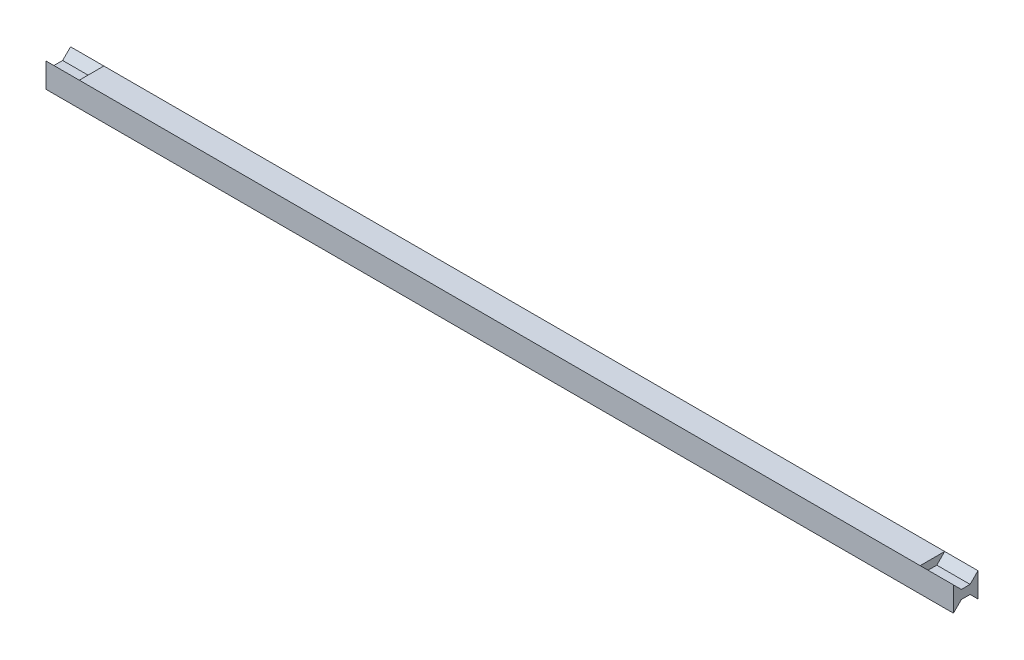
ISO-10303-21;
HEADER;
FILE_DESCRIPTION(('STEP AP214'),'2;1');
FILE_NAME('part.step','',(''),(''),'','','');
FILE_SCHEMA(('AUTOMOTIVE_DESIGN { 1 0 10303 214 1 1 1 1 }'));
ENDSEC;
DATA;
#1=APPLICATION_CONTEXT('core data for automotive mechanical design processes');
#2=APPLICATION_PROTOCOL_DEFINITION('international standard','automotive_design',2000,#1);
#3=PRODUCT_CONTEXT('',#1,'mechanical');
#4=PRODUCT('Part','Part','',(#3));
#5=PRODUCT_RELATED_PRODUCT_CATEGORY('part','',(#4));
#6=PRODUCT_DEFINITION_FORMATION('','',#4);
#7=PRODUCT_DEFINITION_CONTEXT('part definition',#1,'design');
#8=PRODUCT_DEFINITION('design','',#6,#7);
#9=PRODUCT_DEFINITION_SHAPE('','',#8);
#10=(LENGTH_UNIT() NAMED_UNIT(*) SI_UNIT(.MILLI.,.METRE.));
#11=(NAMED_UNIT(*) PLANE_ANGLE_UNIT() SI_UNIT($,.RADIAN.));
#12=(NAMED_UNIT(*) SI_UNIT($,.STERADIAN.) SOLID_ANGLE_UNIT());
#13=UNCERTAINTY_MEASURE_WITH_UNIT(LENGTH_MEASURE(1.E-05),#10,'distance_accuracy_value','');
#14=(GEOMETRIC_REPRESENTATION_CONTEXT(3) GLOBAL_UNCERTAINTY_ASSIGNED_CONTEXT((#13)) GLOBAL_UNIT_ASSIGNED_CONTEXT((#10,
#11,#12)) REPRESENTATION_CONTEXT('',''));
#15=CARTESIAN_POINT('',(0.,0.,0.));
#16=DIRECTION('',(0.,0.,1.));
#17=DIRECTION('',(1.,0.,0.));
#18=AXIS2_PLACEMENT_3D('',#15,#16,#17);
#19=CARTESIAN_POINT('',(202.,5.9,0.));
#20=DIRECTION('',(-1.,0.,0.));
#21=DIRECTION('',(0.,0.,1.));
#22=AXIS2_PLACEMENT_3D('',#19,#20,#21);
#23=PLANE('',#22);
#24=DIRECTION('',(0.,0.707106781186551,0.707106781186544));
#25=VECTOR('',#24,1.);
#26=CARTESIAN_POINT('',(202.,4.,-1.89999999999998));
#27=LINE('',#26,#25);
#28=CARTESIAN_POINT('',(202.,4.,-1.89999999999998));
#29=VERTEX_POINT('',#28);
#30=CARTESIAN_POINT('',(202.,5.9,0.));
#31=VERTEX_POINT('',#30);
#32=EDGE_CURVE('E50',#29,#31,#27,.T.);
#33=ORIENTED_EDGE('',*,*,#32,.F.);
#34=DIRECTION('',(0.,0.,1.));
#35=VECTOR('',#34,1.);
#36=CARTESIAN_POINT('',(202.,4.,-4.00000000000005));
#37=LINE('',#36,#35);
#38=CARTESIAN_POINT('',(202.,4.,-4.00000000000005));
#39=VERTEX_POINT('',#38);
#40=EDGE_CURVE('E54',#39,#29,#37,.T.);
#41=ORIENTED_EDGE('',*,*,#40,.F.);
#42=DIRECTION('',(0.,-0.707106781186551,0.707106781186544));
#43=VECTOR('',#42,1.);
#44=CARTESIAN_POINT('',(202.,5.9,-5.90000000000003));
#45=LINE('',#44,#43);
#46=CARTESIAN_POINT('',(202.,5.9,-5.90000000000003));
#47=VERTEX_POINT('',#46);
#48=EDGE_CURVE('E290',#47,#39,#45,.T.);
#49=ORIENTED_EDGE('',*,*,#48,.F.);
#50=DIRECTION('',(0.,0.,-1.));
#51=VECTOR('',#50,1.);
#52=CARTESIAN_POINT('',(202.,5.9,0.));
#53=LINE('',#52,#51);
#54=EDGE_CURVE('E42',#31,#47,#53,.T.);
#55=ORIENTED_EDGE('',*,*,#54,.F.);
#56=EDGE_LOOP('',(#33,#41,#49,#55));
#57=FACE_BOUND('',#56,.T.);
#58=ADVANCED_FACE('F33',(#57),#23,.F.);
#59=DIRECTION('',(0.,-0.707106781186551,-0.707106781186544));
#60=VECTOR('',#59,1.);
#61=CARTESIAN_POINT('',(202.,1.9,-4.00000000000005));
#62=LINE('',#61,#60);
#63=CARTESIAN_POINT('',(202.,1.9,-4.00000000000005));
#64=VERTEX_POINT('',#63);
#65=CARTESIAN_POINT('',(202.,0.,-5.90000000000003));
#66=VERTEX_POINT('',#65);
#67=EDGE_CURVE('E294',#64,#66,#62,.T.);
#68=ORIENTED_EDGE('',*,*,#67,.F.);
#69=DIRECTION('',(0.,0.,-1.));
#70=VECTOR('',#69,1.);
#71=CARTESIAN_POINT('',(202.,1.9,-1.89999999999998));
#72=LINE('',#71,#70);
#73=CARTESIAN_POINT('',(202.,1.9,-1.89999999999998));
#74=VERTEX_POINT('',#73);
#75=EDGE_CURVE('E297',#74,#64,#72,.T.);
#76=ORIENTED_EDGE('',*,*,#75,.F.);
#77=DIRECTION('',(0.,0.707106781186551,-0.707106781186543));
#78=VECTOR('',#77,1.);
#79=CARTESIAN_POINT('',(202.,0.,0.));
#80=LINE('',#79,#78);
#81=CARTESIAN_POINT('',(202.,0.,0.));
#82=VERTEX_POINT('',#81);
#83=EDGE_CURVE('E321',#82,#74,#80,.T.);
#84=ORIENTED_EDGE('',*,*,#83,.F.);
#85=DIRECTION('',(0.,0.,-1.));
#86=VECTOR('',#85,1.);
#87=CARTESIAN_POINT('',(202.,0.,0.));
#88=LINE('',#87,#86);
#89=EDGE_CURVE('E244',#82,#66,#88,.T.);
#90=ORIENTED_EDGE('',*,*,#89,.T.);
#91=EDGE_LOOP('',(#68,#76,#84,#90));
#92=FACE_BOUND('',#91,.T.);
#93=ADVANCED_FACE('F349',(#92),#23,.F.);
#94=CARTESIAN_POINT('',(0.,5.9,-5.9));
#95=DIRECTION('',(1.,0.,0.));
#96=DIRECTION('',(0.,0.,-1.));
#97=AXIS2_PLACEMENT_3D('',#94,#95,#96);
#98=PLANE('',#97);
#99=DIRECTION('',(0.,0.707106781186551,-0.707106781186544));
#100=VECTOR('',#99,1.);
#101=CARTESIAN_POINT('',(0.,4.,-4.00000000000002));
#102=LINE('',#101,#100);
#103=CARTESIAN_POINT('',(0.,4.,-4.00000000000002));
#104=VERTEX_POINT('',#103);
#105=CARTESIAN_POINT('',(0.,5.9,-5.9));
#106=VERTEX_POINT('',#105);
#107=EDGE_CURVE('E169',#104,#106,#102,.T.);
#108=ORIENTED_EDGE('',*,*,#107,.F.);
#109=DIRECTION('',(0.,0.,-1.));
#110=VECTOR('',#109,1.);
#111=CARTESIAN_POINT('',(0.,4.,-1.89999999999998));
#112=LINE('',#111,#110);
#113=CARTESIAN_POINT('',(0.,4.,-1.89999999999998));
#114=VERTEX_POINT('',#113);
#115=EDGE_CURVE('E182',#114,#104,#112,.T.);
#116=ORIENTED_EDGE('',*,*,#115,.F.);
#117=DIRECTION('',(0.,-0.707106781186552,-0.707106781186543));
#118=VECTOR('',#117,1.);
#119=CARTESIAN_POINT('',(0.,5.9,0.));
#120=LINE('',#119,#118);
#121=CARTESIAN_POINT('',(0.,5.9,0.));
#122=VERTEX_POINT('',#121);
#123=EDGE_CURVE('E205',#122,#114,#120,.T.);
#124=ORIENTED_EDGE('',*,*,#123,.F.);
#125=DIRECTION('',(0.,0.,1.));
#126=VECTOR('',#125,1.);
#127=CARTESIAN_POINT('',(0.,5.9,-5.9));
#128=LINE('',#127,#126);
#129=EDGE_CURVE('E234',#106,#122,#128,.T.);
#130=ORIENTED_EDGE('',*,*,#129,.F.);
#131=EDGE_LOOP('',(#108,#116,#124,#130));
#132=FACE_BOUND('',#131,.T.);
#133=ADVANCED_FACE('F35',(#132),#98,.F.);
#134=DIRECTION('',(0.,-0.707106781186543,0.707106781186552));
#135=VECTOR('',#134,1.);
#136=CARTESIAN_POINT('',(0.,1.9,-1.90000000000002));
#137=LINE('',#136,#135);
#138=CARTESIAN_POINT('',(0.,1.9,-1.90000000000002));
#139=VERTEX_POINT('',#138);
#140=CARTESIAN_POINT('',(0.,0.,0.));
#141=VERTEX_POINT('',#140);
#142=EDGE_CURVE('E202',#139,#141,#137,.T.);
#143=ORIENTED_EDGE('',*,*,#142,.F.);
#144=DIRECTION('',(0.,0.,1.));
#145=VECTOR('',#144,1.);
#146=CARTESIAN_POINT('',(0.,1.9,-4.00000000000002));
#147=LINE('',#146,#145);
#148=CARTESIAN_POINT('',(0.,1.9,-4.00000000000002));
#149=VERTEX_POINT('',#148);
#150=EDGE_CURVE('E199',#149,#139,#147,.T.);
#151=ORIENTED_EDGE('',*,*,#150,.F.);
#152=DIRECTION('',(0.,0.707106781186552,0.707106781186543));
#153=VECTOR('',#152,1.);
#154=CARTESIAN_POINT('',(0.,0.,-5.9));
#155=LINE('',#154,#153);
#156=CARTESIAN_POINT('',(0.,0.,-5.9));
#157=VERTEX_POINT('',#156);
#158=EDGE_CURVE('E172',#157,#149,#155,.T.);
#159=ORIENTED_EDGE('',*,*,#158,.F.);
#160=DIRECTION('',(0.,0.,1.));
#161=VECTOR('',#160,1.);
#162=CARTESIAN_POINT('',(0.,0.,-5.9));
#163=LINE('',#162,#161);
#164=EDGE_CURVE('E233',#157,#141,#163,.T.);
#165=ORIENTED_EDGE('',*,*,#164,.T.);
#166=EDGE_LOOP('',(#143,#151,#159,#165));
#167=FACE_BOUND('',#166,.T.);
#168=ADVANCED_FACE('F357',(#167),#98,.F.);
#169=CARTESIAN_POINT('',(0.,5.9,0.));
#170=DIRECTION('',(0.,0.,-1.));
#171=DIRECTION('',(-1.,0.,0.));
#172=AXIS2_PLACEMENT_3D('',#169,#170,#171);
#173=PLANE('',#172);
#174=DIRECTION('',(1.,0.,0.));
#175=VECTOR('',#174,1.);
#176=CARTESIAN_POINT('',(0.,0.,0.));
#177=LINE('',#176,#175);
#178=EDGE_CURVE('E243',#141,#82,#177,.T.);
#179=ORIENTED_EDGE('',*,*,#178,.T.);
#180=DIRECTION('',(-1.,0.,0.));
#181=VECTOR('',#180,1.);
#182=CARTESIAN_POINT('',(210.,0.,0.));
#183=LINE('',#182,#181);
#184=CARTESIAN_POINT('',(210.,0.,0.));
#185=VERTEX_POINT('',#184);
#186=EDGE_CURVE('E154',#185,#82,#183,.T.);
#187=ORIENTED_EDGE('',*,*,#186,.F.);
#188=DIRECTION('',(0.,-1.,0.));
#189=VECTOR('',#188,1.);
#190=CARTESIAN_POINT('',(210.,5.9,0.));
#191=LINE('',#190,#189);
#192=CARTESIAN_POINT('',(210.,5.9,0.));
#193=VERTEX_POINT('',#192);
#194=EDGE_CURVE('E146',#193,#185,#191,.T.);
#195=ORIENTED_EDGE('',*,*,#194,.F.);
#196=DIRECTION('',(-1.,0.,0.));
#197=VECTOR('',#196,1.);
#198=CARTESIAN_POINT('',(210.,5.9,0.));
#199=LINE('',#198,#197);
#200=EDGE_CURVE('E152',#193,#31,#199,.T.);
#201=ORIENTED_EDGE('',*,*,#200,.T.);
#202=DIRECTION('',(1.,0.,0.));
#203=VECTOR('',#202,1.);
#204=CARTESIAN_POINT('',(0.,5.9,0.));
#205=LINE('',#204,#203);
#206=EDGE_CURVE('E237',#122,#31,#205,.T.);
#207=ORIENTED_EDGE('',*,*,#206,.F.);
#208=DIRECTION('',(1.,0.,0.));
#209=VECTOR('',#208,1.);
#210=CARTESIAN_POINT('',(-8.,5.9,0.));
#211=LINE('',#210,#209);
#212=CARTESIAN_POINT('',(-8.,5.9,0.));
#213=VERTEX_POINT('',#212);
#214=EDGE_CURVE('E215',#213,#122,#211,.T.);
#215=ORIENTED_EDGE('',*,*,#214,.F.);
#216=DIRECTION('',(0.,1.,0.));
#217=VECTOR('',#216,1.);
#218=CARTESIAN_POINT('',(-8.,0.,0.));
#219=LINE('',#218,#217);
#220=CARTESIAN_POINT('',(-8.,0.,0.));
#221=VERTEX_POINT('',#220);
#222=EDGE_CURVE('E190',#221,#213,#219,.T.);
#223=ORIENTED_EDGE('',*,*,#222,.F.);
#224=DIRECTION('',(1.,0.,0.));
#225=VECTOR('',#224,1.);
#226=CARTESIAN_POINT('',(-8.,0.,0.));
#227=LINE('',#226,#225);
#228=EDGE_CURVE('E218',#221,#141,#227,.T.);
#229=ORIENTED_EDGE('',*,*,#228,.T.);
#230=EDGE_LOOP('',(#179,#187,#195,#201,#207,#215,#223,#229));
#231=FACE_BOUND('',#230,.T.);
#232=ADVANCED_FACE('F149',(#231),#173,.F.);
#233=CARTESIAN_POINT('',(202.,5.9,-5.90000000000003));
#234=DIRECTION('',(0.,0.,1.));
#235=DIRECTION('',(1.,0.,0.));
#236=AXIS2_PLACEMENT_3D('',#233,#234,#235);
#237=PLANE('',#236);
#238=DIRECTION('',(-1.,0.,0.));
#239=VECTOR('',#238,1.);
#240=CARTESIAN_POINT('',(202.,0.,-5.90000000000003));
#241=LINE('',#240,#239);
#242=EDGE_CURVE('E37',#66,#157,#241,.T.);
#243=ORIENTED_EDGE('',*,*,#242,.T.);
#244=DIRECTION('',(1.,0.,0.));
#245=VECTOR('',#244,1.);
#246=CARTESIAN_POINT('',(-8.,0.,-5.9));
#247=LINE('',#246,#245);
#248=CARTESIAN_POINT('',(-8.,0.,-5.9));
#249=VERTEX_POINT('',#248);
#250=EDGE_CURVE('E227',#249,#157,#247,.T.);
#251=ORIENTED_EDGE('',*,*,#250,.F.);
#252=DIRECTION('',(0.,-1.,0.));
#253=VECTOR('',#252,1.);
#254=CARTESIAN_POINT('',(-8.,5.9,-5.9));
#255=LINE('',#254,#253);
#256=CARTESIAN_POINT('',(-8.,5.9,-5.9));
#257=VERTEX_POINT('',#256);
#258=EDGE_CURVE('E181',#257,#249,#255,.T.);
#259=ORIENTED_EDGE('',*,*,#258,.F.);
#260=DIRECTION('',(1.,0.,0.));
#261=VECTOR('',#260,1.);
#262=CARTESIAN_POINT('',(-8.,5.9,-5.9));
#263=LINE('',#262,#261);
#264=EDGE_CURVE('E230',#257,#106,#263,.T.);
#265=ORIENTED_EDGE('',*,*,#264,.T.);
#266=DIRECTION('',(-1.,0.,0.));
#267=VECTOR('',#266,1.);
#268=CARTESIAN_POINT('',(202.,5.9,-5.90000000000003));
#269=LINE('',#268,#267);
#270=EDGE_CURVE('E11',#47,#106,#269,.T.);
#271=ORIENTED_EDGE('',*,*,#270,.F.);
#272=DIRECTION('',(-1.,0.,0.));
#273=VECTOR('',#272,1.);
#274=CARTESIAN_POINT('',(210.,5.9,-5.90000000000003));
#275=LINE('',#274,#273);
#276=CARTESIAN_POINT('',(210.,5.9,-5.90000000000003));
#277=VERTEX_POINT('',#276);
#278=EDGE_CURVE('E305',#277,#47,#275,.T.);
#279=ORIENTED_EDGE('',*,*,#278,.F.);
#280=DIRECTION('',(0.,1.,0.));
#281=VECTOR('',#280,1.);
#282=CARTESIAN_POINT('',(210.,0.,-5.90000000000003));
#283=LINE('',#282,#281);
#284=CARTESIAN_POINT('',(210.,0.,-5.90000000000003));
#285=VERTEX_POINT('',#284);
#286=EDGE_CURVE('E328',#285,#277,#283,.T.);
#287=ORIENTED_EDGE('',*,*,#286,.F.);
#288=DIRECTION('',(-1.,0.,0.));
#289=VECTOR('',#288,1.);
#290=CARTESIAN_POINT('',(210.,0.,-5.90000000000003));
#291=LINE('',#290,#289);
#292=EDGE_CURVE('E257',#285,#66,#291,.T.);
#293=ORIENTED_EDGE('',*,*,#292,.T.);
#294=EDGE_LOOP('',(#243,#251,#259,#265,#271,#279,#287,#293));
#295=FACE_BOUND('',#294,.T.);
#296=ADVANCED_FACE('F253',(#295),#237,.F.);
#297=CARTESIAN_POINT('',(0.,5.9,0.));
#298=DIRECTION('',(0.,1.,0.));
#299=DIRECTION('',(0.,0.,1.));
#300=AXIS2_PLACEMENT_3D('',#297,#298,#299);
#301=PLANE('',#300);
#302=ORIENTED_EDGE('',*,*,#129,.T.);
#303=ORIENTED_EDGE('',*,*,#206,.T.);
#304=ORIENTED_EDGE('',*,*,#54,.T.);
#305=ORIENTED_EDGE('',*,*,#270,.T.);
#306=EDGE_LOOP('',(#302,#303,#304,#305));
#307=FACE_BOUND('',#306,.T.);
#308=ADVANCED_FACE('F289',(#307),#301,.T.);
#309=CARTESIAN_POINT('',(0.,0.,0.));
#310=DIRECTION('',(0.,1.,0.));
#311=DIRECTION('',(0.,0.,1.));
#312=AXIS2_PLACEMENT_3D('',#309,#310,#311);
#313=PLANE('',#312);
#314=ORIENTED_EDGE('',*,*,#164,.F.);
#315=ORIENTED_EDGE('',*,*,#242,.F.);
#316=ORIENTED_EDGE('',*,*,#89,.F.);
#317=ORIENTED_EDGE('',*,*,#178,.F.);
#318=EDGE_LOOP('',(#314,#315,#316,#317));
#319=FACE_BOUND('',#318,.T.);
#320=ADVANCED_FACE('F260',(#319),#313,.F.);
#321=CARTESIAN_POINT('',(-8.,4.,-4.00000000000002));
#322=DIRECTION('',(0.,-0.707106781186544,-0.707106781186551));
#323=DIRECTION('',(0.,0.707106781186551,-0.707106781186544));
#324=AXIS2_PLACEMENT_3D('',#321,#322,#323);
#325=PLANE('',#324);
#326=ORIENTED_EDGE('',*,*,#107,.T.);
#327=ORIENTED_EDGE('',*,*,#264,.F.);
#328=DIRECTION('',(0.,0.707106781186551,-0.707106781186544));
#329=VECTOR('',#328,1.);
#330=CARTESIAN_POINT('',(-8.,4.,-4.00000000000002));
#331=LINE('',#330,#329);
#332=CARTESIAN_POINT('',(-8.,4.,-4.00000000000002));
#333=VERTEX_POINT('',#332);
#334=EDGE_CURVE('E178',#333,#257,#331,.T.);
#335=ORIENTED_EDGE('',*,*,#334,.F.);
#336=DIRECTION('',(1.,0.,0.));
#337=VECTOR('',#336,1.);
#338=CARTESIAN_POINT('',(-8.,4.,-4.00000000000002));
#339=LINE('',#338,#337);
#340=EDGE_CURVE('E195',#333,#104,#339,.T.);
#341=ORIENTED_EDGE('',*,*,#340,.T.);
#342=EDGE_LOOP('',(#326,#327,#335,#341));
#343=FACE_BOUND('',#342,.T.);
#344=ADVANCED_FACE('F275',(#343),#325,.F.);
#345=CARTESIAN_POINT('',(-8.,0.,-5.9));
#346=DIRECTION('',(0.,0.707106781186543,-0.707106781186552));
#347=DIRECTION('',(0.,0.707106781186552,0.707106781186543));
#348=AXIS2_PLACEMENT_3D('',#345,#346,#347);
#349=PLANE('',#348);
#350=ORIENTED_EDGE('',*,*,#158,.T.);
#351=DIRECTION('',(1.,0.,0.));
#352=VECTOR('',#351,1.);
#353=CARTESIAN_POINT('',(-8.,1.9,-4.00000000000002));
#354=LINE('',#353,#352);
#355=CARTESIAN_POINT('',(-8.,1.9,-4.00000000000002));
#356=VERTEX_POINT('',#355);
#357=EDGE_CURVE('E224',#356,#149,#354,.T.);
#358=ORIENTED_EDGE('',*,*,#357,.F.);
#359=DIRECTION('',(0.,0.707106781186552,0.707106781186543));
#360=VECTOR('',#359,1.);
#361=CARTESIAN_POINT('',(-8.,0.,-5.9));
#362=LINE('',#361,#360);
#363=EDGE_CURVE('E184',#249,#356,#362,.T.);
#364=ORIENTED_EDGE('',*,*,#363,.F.);
#365=ORIENTED_EDGE('',*,*,#250,.T.);
#366=EDGE_LOOP('',(#350,#358,#364,#365));
#367=FACE_BOUND('',#366,.T.);
#368=ADVANCED_FACE('F263',(#367),#349,.F.);
#369=CARTESIAN_POINT('',(-8.,1.9,-4.00000000000002));
#370=DIRECTION('',(0.,1.,0.));
#371=DIRECTION('',(0.,0.,1.));
#372=AXIS2_PLACEMENT_3D('',#369,#370,#371);
#373=PLANE('',#372);
#374=ORIENTED_EDGE('',*,*,#150,.T.);
#375=DIRECTION('',(1.,0.,0.));
#376=VECTOR('',#375,1.);
#377=CARTESIAN_POINT('',(-8.,1.9,-1.90000000000002));
#378=LINE('',#377,#376);
#379=CARTESIAN_POINT('',(-8.,1.9,-1.90000000000002));
#380=VERTEX_POINT('',#379);
#381=EDGE_CURVE('E221',#380,#139,#378,.T.);
#382=ORIENTED_EDGE('',*,*,#381,.F.);
#383=DIRECTION('',(0.,0.,1.));
#384=VECTOR('',#383,1.);
#385=CARTESIAN_POINT('',(-8.,1.9,-4.00000000000002));
#386=LINE('',#385,#384);
#387=EDGE_CURVE('E186',#356,#380,#386,.T.);
#388=ORIENTED_EDGE('',*,*,#387,.F.);
#389=ORIENTED_EDGE('',*,*,#357,.T.);
#390=EDGE_LOOP('',(#374,#382,#388,#389));
#391=FACE_BOUND('',#390,.T.);
#392=ADVANCED_FACE('F368',(#391),#373,.F.);
#393=CARTESIAN_POINT('',(-8.,1.9,-1.90000000000002));
#394=DIRECTION('',(0.,0.707106781186552,0.707106781186543));
#395=DIRECTION('',(0.,-0.707106781186543,0.707106781186552));
#396=AXIS2_PLACEMENT_3D('',#393,#394,#395);
#397=PLANE('',#396);
#398=ORIENTED_EDGE('',*,*,#142,.T.);
#399=ORIENTED_EDGE('',*,*,#228,.F.);
#400=DIRECTION('',(0.,-0.707106781186543,0.707106781186552));
#401=VECTOR('',#400,1.);
#402=CARTESIAN_POINT('',(-8.,1.9,-1.90000000000002));
#403=LINE('',#402,#401);
#404=EDGE_CURVE('E188',#380,#221,#403,.T.);
#405=ORIENTED_EDGE('',*,*,#404,.F.);
#406=ORIENTED_EDGE('',*,*,#381,.T.);
#407=EDGE_LOOP('',(#398,#399,#405,#406));
#408=FACE_BOUND('',#407,.T.);
#409=ADVANCED_FACE('F370',(#408),#397,.F.);
#410=CARTESIAN_POINT('',(-8.,5.9,0.));
#411=DIRECTION('',(0.,-0.707106781186543,0.707106781186552));
#412=DIRECTION('',(0.,-0.707106781186552,-0.707106781186543));
#413=AXIS2_PLACEMENT_3D('',#410,#411,#412);
#414=PLANE('',#413);
#415=ORIENTED_EDGE('',*,*,#123,.T.);
#416=DIRECTION('',(1.,0.,0.));
#417=VECTOR('',#416,1.);
#418=CARTESIAN_POINT('',(-8.,4.,-1.89999999999998));
#419=LINE('',#418,#417);
#420=CARTESIAN_POINT('',(-8.,4.,-1.89999999999998));
#421=VERTEX_POINT('',#420);
#422=EDGE_CURVE('E212',#421,#114,#419,.T.);
#423=ORIENTED_EDGE('',*,*,#422,.F.);
#424=DIRECTION('',(0.,-0.707106781186552,-0.707106781186543));
#425=VECTOR('',#424,1.);
#426=CARTESIAN_POINT('',(-8.,5.9,0.));
#427=LINE('',#426,#425);
#428=EDGE_CURVE('E192',#213,#421,#427,.T.);
#429=ORIENTED_EDGE('',*,*,#428,.F.);
#430=ORIENTED_EDGE('',*,*,#214,.T.);
#431=EDGE_LOOP('',(#415,#423,#429,#430));
#432=FACE_BOUND('',#431,.T.);
#433=ADVANCED_FACE('F285',(#432),#414,.F.);
#434=CARTESIAN_POINT('',(-8.,4.,-1.89999999999998));
#435=DIRECTION('',(0.,-1.,0.));
#436=DIRECTION('',(0.,0.,-1.));
#437=AXIS2_PLACEMENT_3D('',#434,#435,#436);
#438=PLANE('',#437);
#439=ORIENTED_EDGE('',*,*,#115,.T.);
#440=ORIENTED_EDGE('',*,*,#340,.F.);
#441=DIRECTION('',(0.,0.,-1.));
#442=VECTOR('',#441,1.);
#443=CARTESIAN_POINT('',(-8.,4.,-1.89999999999998));
#444=LINE('',#443,#442);
#445=EDGE_CURVE('E194',#421,#333,#444,.T.);
#446=ORIENTED_EDGE('',*,*,#445,.F.);
#447=ORIENTED_EDGE('',*,*,#422,.T.);
#448=EDGE_LOOP('',(#439,#440,#446,#447));
#449=FACE_BOUND('',#448,.T.);
#450=ADVANCED_FACE('F280',(#449),#438,.F.);
#451=CARTESIAN_POINT('',(-8.,0.,0.));
#452=DIRECTION('',(1.,0.,0.));
#453=DIRECTION('',(0.,0.,-1.));
#454=AXIS2_PLACEMENT_3D('',#451,#452,#453);
#455=PLANE('',#454);
#456=ORIENTED_EDGE('',*,*,#334,.T.);
#457=ORIENTED_EDGE('',*,*,#258,.T.);
#458=ORIENTED_EDGE('',*,*,#363,.T.);
#459=ORIENTED_EDGE('',*,*,#387,.T.);
#460=ORIENTED_EDGE('',*,*,#404,.T.);
#461=ORIENTED_EDGE('',*,*,#222,.T.);
#462=ORIENTED_EDGE('',*,*,#428,.T.);
#463=ORIENTED_EDGE('',*,*,#445,.T.);
#464=EDGE_LOOP('',(#456,#457,#458,#459,#460,#461,#462,#463));
#465=FACE_BOUND('',#464,.T.);
#466=ADVANCED_FACE('F267',(#465),#455,.F.);
#467=CARTESIAN_POINT('',(210.,4.,-1.89999999999998));
#468=DIRECTION('',(0.,-0.707106781186544,0.707106781186551));
#469=DIRECTION('',(0.,-0.707106781186551,-0.707106781186544));
#470=AXIS2_PLACEMENT_3D('',#467,#468,#469);
#471=PLANE('',#470);
#472=ORIENTED_EDGE('',*,*,#32,.T.);
#473=ORIENTED_EDGE('',*,*,#200,.F.);
#474=DIRECTION('',(0.,0.707106781186551,0.707106781186544));
#475=VECTOR('',#474,1.);
#476=CARTESIAN_POINT('',(210.,4.,-1.89999999999998));
#477=LINE('',#476,#475);
#478=CARTESIAN_POINT('',(210.,4.,-1.89999999999998));
#479=VERTEX_POINT('',#478);
#480=EDGE_CURVE('E158',#479,#193,#477,.T.);
#481=ORIENTED_EDGE('',*,*,#480,.F.);
#482=DIRECTION('',(-1.,0.,0.));
#483=VECTOR('',#482,1.);
#484=CARTESIAN_POINT('',(210.,4.,-1.89999999999998));
#485=LINE('',#484,#483);
#486=EDGE_CURVE('E301',#479,#29,#485,.T.);
#487=ORIENTED_EDGE('',*,*,#486,.T.);
#488=EDGE_LOOP('',(#472,#473,#481,#487));
#489=FACE_BOUND('',#488,.T.);
#490=ADVANCED_FACE('F168',(#489),#471,.F.);
#491=CARTESIAN_POINT('',(210.,0.,0.));
#492=DIRECTION('',(0.,0.707106781186543,0.707106781186552));
#493=DIRECTION('',(0.,-0.707106781186552,0.707106781186543));
#494=AXIS2_PLACEMENT_3D('',#491,#492,#493);
#495=PLANE('',#494);
#496=ORIENTED_EDGE('',*,*,#83,.T.);
#497=DIRECTION('',(-1.,0.,0.));
#498=VECTOR('',#497,1.);
#499=CARTESIAN_POINT('',(210.,1.9,-1.89999999999998));
#500=LINE('',#499,#498);
#501=CARTESIAN_POINT('',(210.,1.9,-1.89999999999998));
#502=VERTEX_POINT('',#501);
#503=EDGE_CURVE('E174',#502,#74,#500,.T.);
#504=ORIENTED_EDGE('',*,*,#503,.F.);
#505=DIRECTION('',(0.,0.707106781186551,-0.707106781186543));
#506=VECTOR('',#505,1.);
#507=CARTESIAN_POINT('',(210.,0.,0.));
#508=LINE('',#507,#506);
#509=EDGE_CURVE('E157',#185,#502,#508,.T.);
#510=ORIENTED_EDGE('',*,*,#509,.F.);
#511=ORIENTED_EDGE('',*,*,#186,.T.);
#512=EDGE_LOOP('',(#496,#504,#510,#511));
#513=FACE_BOUND('',#512,.T.);
#514=ADVANCED_FACE('F320',(#513),#495,.F.);
#515=CARTESIAN_POINT('',(210.,1.9,-1.89999999999998));
#516=DIRECTION('',(0.,1.,0.));
#517=DIRECTION('',(0.,0.,1.));
#518=AXIS2_PLACEMENT_3D('',#515,#516,#517);
#519=PLANE('',#518);
#520=ORIENTED_EDGE('',*,*,#75,.T.);
#521=DIRECTION('',(-1.,0.,0.));
#522=VECTOR('',#521,1.);
#523=CARTESIAN_POINT('',(210.,1.9,-4.00000000000005));
#524=LINE('',#523,#522);
#525=CARTESIAN_POINT('',(210.,1.9,-4.00000000000005));
#526=VERTEX_POINT('',#525);
#527=EDGE_CURVE('E308',#526,#64,#524,.T.);
#528=ORIENTED_EDGE('',*,*,#527,.F.);
#529=DIRECTION('',(0.,0.,-1.));
#530=VECTOR('',#529,1.);
#531=CARTESIAN_POINT('',(210.,1.9,-1.89999999999998));
#532=LINE('',#531,#530);
#533=EDGE_CURVE('E317',#502,#526,#532,.T.);
#534=ORIENTED_EDGE('',*,*,#533,.F.);
#535=ORIENTED_EDGE('',*,*,#503,.T.);
#536=EDGE_LOOP('',(#520,#528,#534,#535));
#537=FACE_BOUND('',#536,.T.);
#538=ADVANCED_FACE('F315',(#537),#519,.F.);
#539=CARTESIAN_POINT('',(210.,1.9,-4.00000000000005));
#540=DIRECTION('',(0.,0.707106781186544,-0.707106781186551));
#541=DIRECTION('',(0.,0.707106781186551,0.707106781186544));
#542=AXIS2_PLACEMENT_3D('',#539,#540,#541);
#543=PLANE('',#542);
#544=ORIENTED_EDGE('',*,*,#67,.T.);
#545=ORIENTED_EDGE('',*,*,#292,.F.);
#546=DIRECTION('',(0.,-0.707106781186551,-0.707106781186544));
#547=VECTOR('',#546,1.);
#548=CARTESIAN_POINT('',(210.,1.9,-4.00000000000005));
#549=LINE('',#548,#547);
#550=EDGE_CURVE('E330',#526,#285,#549,.T.);
#551=ORIENTED_EDGE('',*,*,#550,.F.);
#552=ORIENTED_EDGE('',*,*,#527,.T.);
#553=EDGE_LOOP('',(#544,#545,#551,#552));
#554=FACE_BOUND('',#553,.T.);
#555=ADVANCED_FACE('F335',(#554),#543,.F.);
#556=CARTESIAN_POINT('',(210.,5.9,-5.90000000000003));
#557=DIRECTION('',(0.,-0.707106781186544,-0.707106781186551));
#558=DIRECTION('',(0.,0.707106781186551,-0.707106781186544));
#559=AXIS2_PLACEMENT_3D('',#556,#557,#558);
#560=PLANE('',#559);
#561=ORIENTED_EDGE('',*,*,#48,.T.);
#562=DIRECTION('',(-1.,0.,0.));
#563=VECTOR('',#562,1.);
#564=CARTESIAN_POINT('',(210.,4.,-4.00000000000005));
#565=LINE('',#564,#563);
#566=CARTESIAN_POINT('',(210.,4.,-4.00000000000005));
#567=VERTEX_POINT('',#566);
#568=EDGE_CURVE('E303',#567,#39,#565,.T.);
#569=ORIENTED_EDGE('',*,*,#568,.F.);
#570=DIRECTION('',(0.,-0.707106781186551,0.707106781186544));
#571=VECTOR('',#570,1.);
#572=CARTESIAN_POINT('',(210.,5.9,-5.90000000000003));
#573=LINE('',#572,#571);
#574=EDGE_CURVE('E326',#277,#567,#573,.T.);
#575=ORIENTED_EDGE('',*,*,#574,.F.);
#576=ORIENTED_EDGE('',*,*,#278,.T.);
#577=EDGE_LOOP('',(#561,#569,#575,#576));
#578=FACE_BOUND('',#577,.T.);
#579=ADVANCED_FACE('F337',(#578),#560,.F.);
#580=CARTESIAN_POINT('',(210.,4.,-4.00000000000005));
#581=DIRECTION('',(0.,-1.,0.));
#582=DIRECTION('',(0.,0.,-1.));
#583=AXIS2_PLACEMENT_3D('',#580,#581,#582);
#584=PLANE('',#583);
#585=ORIENTED_EDGE('',*,*,#40,.T.);
#586=ORIENTED_EDGE('',*,*,#486,.F.);
#587=DIRECTION('',(0.,0.,1.));
#588=VECTOR('',#587,1.);
#589=CARTESIAN_POINT('',(210.,4.,-4.00000000000005));
#590=LINE('',#589,#588);
#591=EDGE_CURVE('E163',#567,#479,#590,.T.);
#592=ORIENTED_EDGE('',*,*,#591,.F.);
#593=ORIENTED_EDGE('',*,*,#568,.T.);
#594=EDGE_LOOP('',(#585,#586,#592,#593));
#595=FACE_BOUND('',#594,.T.);
#596=ADVANCED_FACE('F339',(#595),#584,.F.);
#597=CARTESIAN_POINT('',(210.,0.,0.));
#598=DIRECTION('',(-1.,0.,0.));
#599=DIRECTION('',(0.,0.,1.));
#600=AXIS2_PLACEMENT_3D('',#597,#598,#599);
#601=PLANE('',#600);
#602=ORIENTED_EDGE('',*,*,#480,.T.);
#603=ORIENTED_EDGE('',*,*,#194,.T.);
#604=ORIENTED_EDGE('',*,*,#509,.T.);
#605=ORIENTED_EDGE('',*,*,#533,.T.);
#606=ORIENTED_EDGE('',*,*,#550,.T.);
#607=ORIENTED_EDGE('',*,*,#286,.T.);
#608=ORIENTED_EDGE('',*,*,#574,.T.);
#609=ORIENTED_EDGE('',*,*,#591,.T.);
#610=EDGE_LOOP('',(#602,#603,#604,#605,#606,#607,#608,#609));
#611=FACE_BOUND('',#610,.T.);
#612=ADVANCED_FACE('F161',(#611),#601,.F.);
#613=CLOSED_SHELL('',(#58,#93,#133,#168,#232,#296,#308,#320,#344,#368,#392,#409,#433,#450,#466,
#490,#514,#538,#555,#579,#596,#612));
#614=MANIFOLD_SOLID_BREP('B2',#613);
#615=ADVANCED_BREP_SHAPE_REPRESENTATION('',(#18,#614),#14);
#616=SHAPE_DEFINITION_REPRESENTATION(#9,#615);
ENDSEC;
END-ISO-10303-21;
